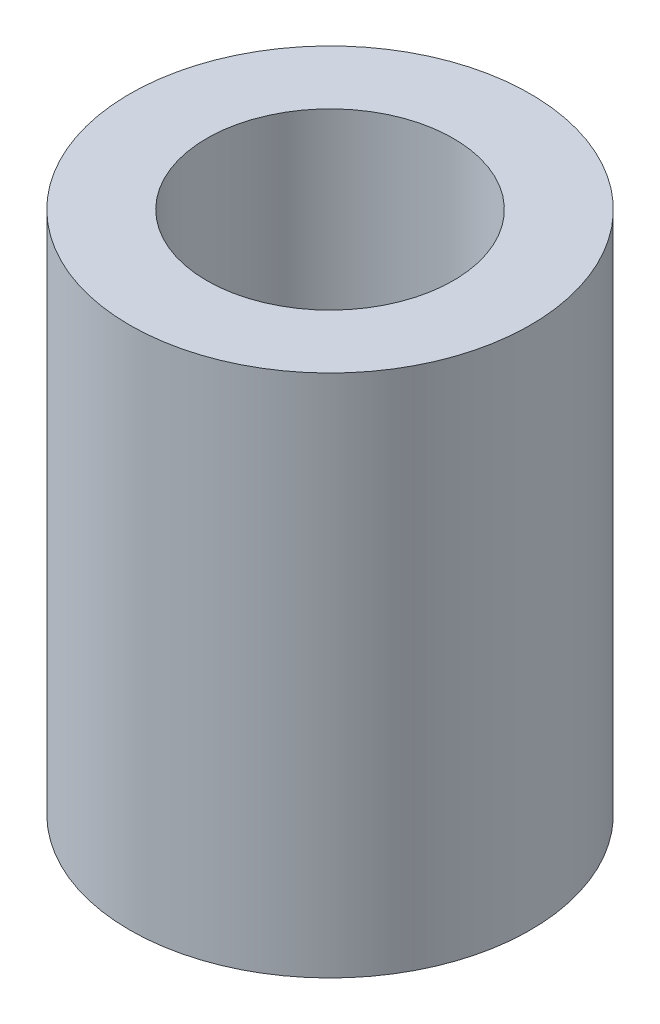
ISO-10303-21;
HEADER;
FILE_DESCRIPTION(('STEP AP214'),'2;1');
FILE_NAME('part.step','',(''),(''),'','','');
FILE_SCHEMA(('AUTOMOTIVE_DESIGN { 1 0 10303 214 1 1 1 1 }'));
ENDSEC;
DATA;
#1=APPLICATION_CONTEXT('core data for automotive mechanical design processes');
#2=APPLICATION_PROTOCOL_DEFINITION('international standard','automotive_design',2000,#1);
#3=PRODUCT_CONTEXT('',#1,'mechanical');
#4=PRODUCT('Part','Part','',(#3));
#5=PRODUCT_RELATED_PRODUCT_CATEGORY('part','',(#4));
#6=PRODUCT_DEFINITION_FORMATION('','',#4);
#7=PRODUCT_DEFINITION_CONTEXT('part definition',#1,'design');
#8=PRODUCT_DEFINITION('design','',#6,#7);
#9=PRODUCT_DEFINITION_SHAPE('','',#8);
#10=(LENGTH_UNIT() NAMED_UNIT(*) SI_UNIT(.MILLI.,.METRE.));
#11=(NAMED_UNIT(*) PLANE_ANGLE_UNIT() SI_UNIT($,.RADIAN.));
#12=(NAMED_UNIT(*) SI_UNIT($,.STERADIAN.) SOLID_ANGLE_UNIT());
#13=UNCERTAINTY_MEASURE_WITH_UNIT(LENGTH_MEASURE(1.E-05),#10,'distance_accuracy_value','');
#14=(GEOMETRIC_REPRESENTATION_CONTEXT(3) GLOBAL_UNCERTAINTY_ASSIGNED_CONTEXT((#13)) GLOBAL_UNIT_ASSIGNED_CONTEXT((#10,
#11,#12)) REPRESENTATION_CONTEXT('',''));
#15=CARTESIAN_POINT('',(0.,0.,0.));
#16=DIRECTION('',(0.,0.,1.));
#17=DIRECTION('',(1.,0.,0.));
#18=AXIS2_PLACEMENT_3D('',#15,#16,#17);
#19=CARTESIAN_POINT('',(0.,17.,0.));
#20=DIRECTION('',(0.,1.,0.));
#21=DIRECTION('',(0.,0.,1.));
#22=AXIS2_PLACEMENT_3D('',#19,#20,#21);
#23=PLANE('',#22);
#24=CARTESIAN_POINT('',(0.,17.,0.));
#25=DIRECTION('',(0.,1.,0.));
#26=DIRECTION('',(0.,0.,1.));
#27=AXIS2_PLACEMENT_3D('',#24,#25,#26);
#28=CIRCLE('',#27,6.5);
#29=CARTESIAN_POINT('',(0.,17.,6.5));
#30=VERTEX_POINT('',#29);
#31=EDGE_CURVE('E10',#30,#30,#28,.T.);
#32=ORIENTED_EDGE('',*,*,#31,.T.);
#33=EDGE_LOOP('',(#32));
#34=FACE_BOUND('',#33,.T.);
#35=CARTESIAN_POINT('',(0.,17.,0.));
#36=DIRECTION('',(0.,1.,0.));
#37=DIRECTION('',(0.,0.,1.));
#38=AXIS2_PLACEMENT_3D('',#35,#36,#37);
#39=CIRCLE('',#38,4.);
#40=CARTESIAN_POINT('',(0.,17.,4.));
#41=VERTEX_POINT('',#40);
#42=EDGE_CURVE('E41',#41,#41,#39,.T.);
#43=ORIENTED_EDGE('',*,*,#42,.F.);
#44=EDGE_LOOP('',(#43));
#45=FACE_BOUND('',#44,.T.);
#46=ADVANCED_FACE('F30',(#34,#45),#23,.T.);
#47=CARTESIAN_POINT('',(0.,0.,0.));
#48=DIRECTION('',(0.,1.,0.));
#49=DIRECTION('',(0.,0.,1.));
#50=AXIS2_PLACEMENT_3D('',#47,#48,#49);
#51=PLANE('',#50);
#52=CARTESIAN_POINT('',(0.,0.,0.));
#53=DIRECTION('',(0.,1.,0.));
#54=DIRECTION('',(0.,0.,1.));
#55=AXIS2_PLACEMENT_3D('',#52,#53,#54);
#56=CIRCLE('',#55,6.5);
#57=CARTESIAN_POINT('',(0.,0.,6.5));
#58=VERTEX_POINT('',#57);
#59=EDGE_CURVE('E34',#58,#58,#56,.T.);
#60=ORIENTED_EDGE('',*,*,#59,.F.);
#61=EDGE_LOOP('',(#60));
#62=FACE_BOUND('',#61,.T.);
#63=CARTESIAN_POINT('',(0.,0.,0.));
#64=DIRECTION('',(0.,1.,0.));
#65=DIRECTION('',(0.,0.,1.));
#66=AXIS2_PLACEMENT_3D('',#63,#64,#65);
#67=CIRCLE('',#66,4.);
#68=CARTESIAN_POINT('',(0.,0.,4.));
#69=VERTEX_POINT('',#68);
#70=EDGE_CURVE('E43',#69,#69,#67,.T.);
#71=ORIENTED_EDGE('',*,*,#70,.T.);
#72=EDGE_LOOP('',(#71));
#73=FACE_BOUND('',#72,.T.);
#74=ADVANCED_FACE('F53',(#62,#73),#51,.F.);
#75=CARTESIAN_POINT('',(0.,17.,0.));
#76=DIRECTION('',(0.,-1.,0.));
#77=DIRECTION('',(0.,0.,-1.));
#78=AXIS2_PLACEMENT_3D('',#75,#76,#77);
#79=CYLINDRICAL_SURFACE('',#78,6.5);
#80=ORIENTED_EDGE('',*,*,#31,.F.);
#81=EDGE_LOOP('',(#80));
#82=FACE_BOUND('',#81,.T.);
#83=ORIENTED_EDGE('',*,*,#59,.T.);
#84=EDGE_LOOP('',(#83));
#85=FACE_BOUND('',#84,.T.);
#86=ADVANCED_FACE('F32',(#82,#85),#79,.T.);
#87=CARTESIAN_POINT('',(0.,17.,0.));
#88=DIRECTION('',(0.,-1.,0.));
#89=DIRECTION('',(0.,0.,-1.));
#90=AXIS2_PLACEMENT_3D('',#87,#88,#89);
#91=CYLINDRICAL_SURFACE('',#90,4.);
#92=ORIENTED_EDGE('',*,*,#42,.T.);
#93=EDGE_LOOP('',(#92));
#94=FACE_BOUND('',#93,.T.);
#95=ORIENTED_EDGE('',*,*,#70,.F.);
#96=EDGE_LOOP('',(#95));
#97=FACE_BOUND('',#96,.T.);
#98=ADVANCED_FACE('F49',(#94,#97),#91,.F.);
#99=CLOSED_SHELL('',(#46,#74,#86,#98));
#100=MANIFOLD_SOLID_BREP('B2',#99);
#101=ADVANCED_BREP_SHAPE_REPRESENTATION('',(#18,#100),#14);
#102=SHAPE_DEFINITION_REPRESENTATION(#9,#101);
ENDSEC;
END-ISO-10303-21;
